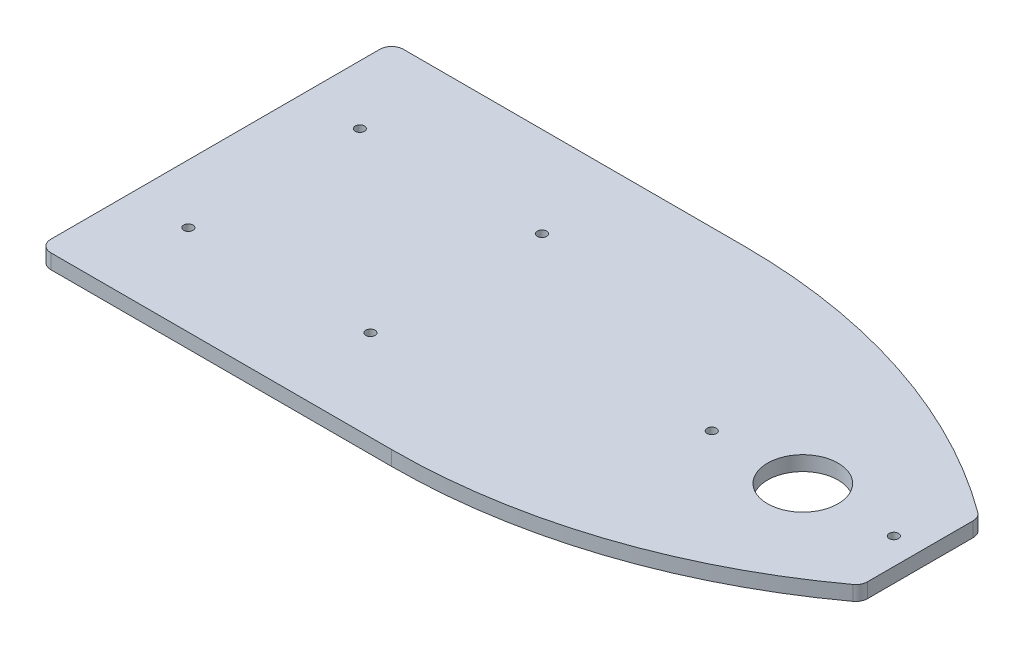
ISO-10303-21;
HEADER;
FILE_DESCRIPTION(('STEP AP214'),'2;1');
FILE_NAME('part.step','',(''),(''),'','','');
FILE_SCHEMA(('AUTOMOTIVE_DESIGN { 1 0 10303 214 1 1 1 1 }'));
ENDSEC;
DATA;
#1=APPLICATION_CONTEXT('core data for automotive mechanical design processes');
#2=APPLICATION_PROTOCOL_DEFINITION('international standard','automotive_design',2000,#1);
#3=PRODUCT_CONTEXT('',#1,'mechanical');
#4=PRODUCT('Part','Part','',(#3));
#5=PRODUCT_RELATED_PRODUCT_CATEGORY('part','',(#4));
#6=PRODUCT_DEFINITION_FORMATION('','',#4);
#7=PRODUCT_DEFINITION_CONTEXT('part definition',#1,'design');
#8=PRODUCT_DEFINITION('design','',#6,#7);
#9=PRODUCT_DEFINITION_SHAPE('','',#8);
#10=(LENGTH_UNIT() NAMED_UNIT(*) SI_UNIT(.MILLI.,.METRE.));
#11=(NAMED_UNIT(*) PLANE_ANGLE_UNIT() SI_UNIT($,.RADIAN.));
#12=(NAMED_UNIT(*) SI_UNIT($,.STERADIAN.) SOLID_ANGLE_UNIT());
#13=UNCERTAINTY_MEASURE_WITH_UNIT(LENGTH_MEASURE(1.E-05),#10,'distance_accuracy_value','');
#14=(GEOMETRIC_REPRESENTATION_CONTEXT(3) GLOBAL_UNCERTAINTY_ASSIGNED_CONTEXT((#13)) GLOBAL_UNIT_ASSIGNED_CONTEXT((#10,
#11,#12)) REPRESENTATION_CONTEXT('',''));
#15=CARTESIAN_POINT('',(0.,0.,0.));
#16=DIRECTION('',(0.,0.,1.));
#17=DIRECTION('',(1.,0.,0.));
#18=AXIS2_PLACEMENT_3D('',#15,#16,#17);
#19=CARTESIAN_POINT('',(76.2,3.175,38.1));
#20=DIRECTION('',(-1.,0.,0.));
#21=DIRECTION('',(0.,0.,1.));
#22=AXIS2_PLACEMENT_3D('',#19,#20,#21);
#23=PLANE('',#22);
#24=DIRECTION('',(0.,0.,-1.));
#25=VECTOR('',#24,1.);
#26=CARTESIAN_POINT('',(76.2,3.175,38.1));
#27=LINE('',#26,#25);
#28=CARTESIAN_POINT('',(76.2,3.175,11.421961703308));
#29=VERTEX_POINT('',#28);
#30=CARTESIAN_POINT('',(76.2,3.175,-11.421961703308));
#31=VERTEX_POINT('',#30);
#32=EDGE_CURVE('E188',#29,#31,#27,.T.);
#33=ORIENTED_EDGE('',*,*,#32,.F.);
#34=DIRECTION('',(0.,1.,0.));
#35=VECTOR('',#34,1.);
#36=CARTESIAN_POINT('',(76.2,3.175,11.421961703308));
#37=LINE('',#36,#35);
#38=CARTESIAN_POINT('',(76.2,0.,11.421961703308));
#39=VERTEX_POINT('',#38);
#40=EDGE_CURVE('E156',#29,#39,#37,.F.);
#41=ORIENTED_EDGE('',*,*,#40,.T.);
#42=DIRECTION('',(0.,0.,-1.));
#43=VECTOR('',#42,1.);
#44=CARTESIAN_POINT('',(76.2,0.,38.1));
#45=LINE('',#44,#43);
#46=CARTESIAN_POINT('',(76.2,0.,-11.421961703308));
#47=VERTEX_POINT('',#46);
#48=EDGE_CURVE('E138',#39,#47,#45,.T.);
#49=ORIENTED_EDGE('',*,*,#48,.T.);
#50=DIRECTION('',(0.,1.,0.));
#51=VECTOR('',#50,1.);
#52=CARTESIAN_POINT('',(76.2,3.175,-11.421961703308));
#53=LINE('',#52,#51);
#54=EDGE_CURVE('E157',#47,#31,#53,.T.);
#55=ORIENTED_EDGE('',*,*,#54,.T.);
#56=EDGE_LOOP('',(#33,#41,#49,#55));
#57=FACE_BOUND('',#56,.T.);
#58=ADVANCED_FACE('F39',(#57),#23,.F.);
#59=CARTESIAN_POINT('',(76.2,3.175,-38.1));
#60=DIRECTION('',(0.,0.,1.));
#61=DIRECTION('',(1.,0.,0.));
#62=AXIS2_PLACEMENT_3D('',#59,#60,#61);
#63=PLANE('',#62);
#64=DIRECTION('',(-1.,0.,0.));
#65=VECTOR('',#64,1.);
#66=CARTESIAN_POINT('',(76.2,0.,-38.1));
#67=LINE('',#66,#65);
#68=CARTESIAN_POINT('',(0.,0.,-38.1));
#69=VERTEX_POINT('',#68);
#70=CARTESIAN_POINT('',(-73.6599999999999,0.,-38.1));
#71=VERTEX_POINT('',#70);
#72=EDGE_CURVE('E132',#69,#71,#67,.T.);
#73=ORIENTED_EDGE('',*,*,#72,.T.);
#74=DIRECTION('',(0.,-1.,0.));
#75=VECTOR('',#74,1.);
#76=CARTESIAN_POINT('',(-73.66,3.175,-38.1));
#77=LINE('',#76,#75);
#78=CARTESIAN_POINT('',(-73.6599999999999,3.175,-38.1));
#79=VERTEX_POINT('',#78);
#80=EDGE_CURVE('E11',#71,#79,#77,.F.);
#81=ORIENTED_EDGE('',*,*,#80,.T.);
#82=DIRECTION('',(-1.,0.,0.));
#83=VECTOR('',#82,1.);
#84=CARTESIAN_POINT('',(76.2,3.175,-38.1));
#85=LINE('',#84,#83);
#86=CARTESIAN_POINT('',(0.,3.175,-38.1));
#87=VERTEX_POINT('',#86);
#88=EDGE_CURVE('E134',#87,#79,#85,.T.);
#89=ORIENTED_EDGE('',*,*,#88,.F.);
#90=DIRECTION('',(0.,1.,0.));
#91=VECTOR('',#90,1.);
#92=CARTESIAN_POINT('',(0.,0.,-38.1));
#93=LINE('',#92,#91);
#94=EDGE_CURVE('E122',#69,#87,#93,.T.);
#95=ORIENTED_EDGE('',*,*,#94,.F.);
#96=EDGE_LOOP('',(#73,#81,#89,#95));
#97=FACE_BOUND('',#96,.T.);
#98=ADVANCED_FACE('F128',(#97),#63,.F.);
#99=CARTESIAN_POINT('',(0.,3.175,0.));
#100=DIRECTION('',(0.,1.,0.));
#101=DIRECTION('',(0.,0.,1.));
#102=AXIS2_PLACEMENT_3D('',#99,#100,#101);
#103=PLANE('',#102);
#104=CARTESIAN_POINT('',(-63.5,3.175,18.542));
#105=DIRECTION('',(0.,1.,0.));
#106=DIRECTION('',(0.,0.,1.));
#107=AXIS2_PLACEMENT_3D('',#104,#105,#106);
#108=CIRCLE('',#107,1.0033);
#109=CARTESIAN_POINT('',(-63.5,3.175,19.5453));
#110=VERTEX_POINT('',#109);
#111=EDGE_CURVE('E235',#110,#110,#108,.T.);
#112=ORIENTED_EDGE('',*,*,#111,.F.);
#113=EDGE_LOOP('',(#112));
#114=FACE_BOUND('',#113,.T.);
#115=CARTESIAN_POINT('',(-24.13,3.175,18.542));
#116=DIRECTION('',(0.,1.,0.));
#117=DIRECTION('',(0.,0.,1.));
#118=AXIS2_PLACEMENT_3D('',#115,#116,#117);
#119=CIRCLE('',#118,1.0033);
#120=CARTESIAN_POINT('',(-24.13,3.175,19.5453));
#121=VERTEX_POINT('',#120);
#122=EDGE_CURVE('E238',#121,#121,#119,.T.);
#123=ORIENTED_EDGE('',*,*,#122,.F.);
#124=EDGE_LOOP('',(#123));
#125=FACE_BOUND('',#124,.T.);
#126=CARTESIAN_POINT('',(-24.13,3.175,-18.542));
#127=DIRECTION('',(0.,1.,0.));
#128=DIRECTION('',(0.,0.,1.));
#129=AXIS2_PLACEMENT_3D('',#126,#127,#128);
#130=CIRCLE('',#129,1.0033);
#131=CARTESIAN_POINT('',(-24.13,3.175,-17.5387));
#132=VERTEX_POINT('',#131);
#133=EDGE_CURVE('E242',#132,#132,#130,.T.);
#134=ORIENTED_EDGE('',*,*,#133,.F.);
#135=EDGE_LOOP('',(#134));
#136=FACE_BOUND('',#135,.T.);
#137=CARTESIAN_POINT('',(-63.5,3.175,-18.542));
#138=DIRECTION('',(0.,1.,0.));
#139=DIRECTION('',(0.,0.,1.));
#140=AXIS2_PLACEMENT_3D('',#137,#138,#139);
#141=CIRCLE('',#140,1.0033);
#142=CARTESIAN_POINT('',(-63.5,3.175,-17.5387));
#143=VERTEX_POINT('',#142);
#144=EDGE_CURVE('E228',#143,#143,#141,.T.);
#145=ORIENTED_EDGE('',*,*,#144,.F.);
#146=EDGE_LOOP('',(#145));
#147=FACE_BOUND('',#146,.T.);
#148=CARTESIAN_POINT('',(31.115,3.175,0.));
#149=DIRECTION('',(0.,1.,0.));
#150=DIRECTION('',(0.,0.,1.));
#151=AXIS2_PLACEMENT_3D('',#148,#149,#150);
#152=CIRCLE('',#151,1.0033);
#153=CARTESIAN_POINT('',(31.115,3.175,1.0033));
#154=VERTEX_POINT('',#153);
#155=EDGE_CURVE('E222',#154,#154,#152,.T.);
#156=ORIENTED_EDGE('',*,*,#155,.F.);
#157=EDGE_LOOP('',(#156));
#158=FACE_BOUND('',#157,.T.);
#159=CARTESIAN_POINT('',(70.485,3.175,0.));
#160=DIRECTION('',(0.,1.,0.));
#161=DIRECTION('',(0.,0.,1.));
#162=AXIS2_PLACEMENT_3D('',#159,#160,#161);
#163=CIRCLE('',#162,1.0033);
#164=CARTESIAN_POINT('',(70.485,3.175,1.0033));
#165=VERTEX_POINT('',#164);
#166=EDGE_CURVE('E219',#165,#165,#163,.T.);
#167=ORIENTED_EDGE('',*,*,#166,.F.);
#168=EDGE_LOOP('',(#167));
#169=FACE_BOUND('',#168,.T.);
#170=CARTESIAN_POINT('',(50.8,3.175,0.));
#171=DIRECTION('',(0.,1.,0.));
#172=DIRECTION('',(0.,0.,1.));
#173=AXIS2_PLACEMENT_3D('',#170,#171,#172);
#174=CIRCLE('',#173,7.62);
#175=CARTESIAN_POINT('',(50.8,3.175,7.62));
#176=VERTEX_POINT('',#175);
#177=EDGE_CURVE('E206',#176,#176,#174,.T.);
#178=ORIENTED_EDGE('',*,*,#177,.F.);
#179=EDGE_LOOP('',(#178));
#180=FACE_BOUND('',#179,.T.);
#181=DIRECTION('',(0.,0.,1.));
#182=VECTOR('',#181,1.);
#183=CARTESIAN_POINT('',(-76.2,3.175,38.1));
#184=LINE('',#183,#182);
#185=CARTESIAN_POINT('',(-76.2,3.175,-35.56));
#186=VERTEX_POINT('',#185);
#187=CARTESIAN_POINT('',(-76.2,3.175,35.56));
#188=VERTEX_POINT('',#187);
#189=EDGE_CURVE('E136',#186,#188,#184,.T.);
#190=ORIENTED_EDGE('',*,*,#189,.T.);
#191=CARTESIAN_POINT('',(-73.66,3.175,35.56));
#192=DIRECTION('',(0.,1.,0.));
#193=DIRECTION('',(0.,0.,1.));
#194=AXIS2_PLACEMENT_3D('',#191,#192,#193);
#195=CIRCLE('',#194,2.54);
#196=CARTESIAN_POINT('',(-73.6599999999999,3.175,38.1));
#197=VERTEX_POINT('',#196);
#198=EDGE_CURVE('E50',#188,#197,#195,.T.);
#199=ORIENTED_EDGE('',*,*,#198,.T.);
#200=DIRECTION('',(1.,0.,0.));
#201=VECTOR('',#200,1.);
#202=CARTESIAN_POINT('',(76.2,3.175,38.1));
#203=LINE('',#202,#201);
#204=CARTESIAN_POINT('',(0.,3.175,38.1));
#205=VERTEX_POINT('',#204);
#206=EDGE_CURVE('E145',#197,#205,#203,.T.);
#207=ORIENTED_EDGE('',*,*,#206,.T.);
#208=CARTESIAN_POINT('',(0.,3.175,-88.9));
#209=DIRECTION('',(0.,-1.,0.));
#210=DIRECTION('',(0.,0.,1.));
#211=AXIS2_PLACEMENT_3D('',#208,#209,#210);
#212=CIRCLE('',#211,127.);
#213=CARTESIAN_POINT('',(75.1632653061225,3.175,13.4693486768449));
#214=VERTEX_POINT('',#213);
#215=EDGE_CURVE('E205',#214,#205,#212,.T.);
#216=ORIENTED_EDGE('',*,*,#215,.F.);
#217=CARTESIAN_POINT('',(73.66,3.175,11.421961703308));
#218=DIRECTION('',(0.,1.,0.));
#219=DIRECTION('',(0.,0.,1.));
#220=AXIS2_PLACEMENT_3D('',#217,#218,#219);
#221=CIRCLE('',#220,2.54);
#222=EDGE_CURVE('E151',#214,#29,#221,.T.);
#223=ORIENTED_EDGE('',*,*,#222,.T.);
#224=ORIENTED_EDGE('',*,*,#32,.T.);
#225=CARTESIAN_POINT('',(73.66,3.175,-11.421961703308));
#226=DIRECTION('',(0.,1.,0.));
#227=DIRECTION('',(0.,0.,1.));
#228=AXIS2_PLACEMENT_3D('',#225,#226,#227);
#229=CIRCLE('',#228,2.54);
#230=CARTESIAN_POINT('',(75.1632653061225,3.175,-13.469348676845));
#231=VERTEX_POINT('',#230);
#232=EDGE_CURVE('E154',#31,#231,#229,.T.);
#233=ORIENTED_EDGE('',*,*,#232,.T.);
#234=CARTESIAN_POINT('',(0.,3.175,88.9));
#235=DIRECTION('',(0.,-1.,0.));
#236=DIRECTION('',(0.,0.,-1.));
#237=AXIS2_PLACEMENT_3D('',#234,#235,#236);
#238=CIRCLE('',#237,127.);
#239=EDGE_CURVE('E129',#87,#231,#238,.T.);
#240=ORIENTED_EDGE('',*,*,#239,.F.);
#241=ORIENTED_EDGE('',*,*,#88,.T.);
#242=CARTESIAN_POINT('',(-73.66,3.175,-35.56));
#243=DIRECTION('',(0.,1.,0.));
#244=DIRECTION('',(0.,0.,1.));
#245=AXIS2_PLACEMENT_3D('',#242,#243,#244);
#246=CIRCLE('',#245,2.54);
#247=EDGE_CURVE('E176',#79,#186,#246,.T.);
#248=ORIENTED_EDGE('',*,*,#247,.T.);
#249=EDGE_LOOP('',(#190,#199,#207,#216,#223,#224,#233,#240,#241,#248));
#250=FACE_BOUND('',#249,.T.);
#251=ADVANCED_FACE('F179',(#114,#125,#136,#147,#158,#169,#180,#250),#103,.T.);
#252=CARTESIAN_POINT('',(0.,0.,0.));
#253=DIRECTION('',(0.,1.,0.));
#254=DIRECTION('',(0.,0.,1.));
#255=AXIS2_PLACEMENT_3D('',#252,#253,#254);
#256=PLANE('',#255);
#257=CARTESIAN_POINT('',(-63.5,0.,18.542));
#258=DIRECTION('',(0.,1.,0.));
#259=DIRECTION('',(0.,0.,1.));
#260=AXIS2_PLACEMENT_3D('',#257,#258,#259);
#261=CIRCLE('',#260,1.0033);
#262=CARTESIAN_POINT('',(-63.5,0.,19.5453));
#263=VERTEX_POINT('',#262);
#264=EDGE_CURVE('E232',#263,#263,#261,.T.);
#265=ORIENTED_EDGE('',*,*,#264,.T.);
#266=EDGE_LOOP('',(#265));
#267=FACE_BOUND('',#266,.T.);
#268=CARTESIAN_POINT('',(-24.13,0.,18.542));
#269=DIRECTION('',(0.,1.,0.));
#270=DIRECTION('',(0.,0.,1.));
#271=AXIS2_PLACEMENT_3D('',#268,#269,#270);
#272=CIRCLE('',#271,1.0033);
#273=CARTESIAN_POINT('',(-24.13,0.,19.5453));
#274=VERTEX_POINT('',#273);
#275=EDGE_CURVE('E241',#274,#274,#272,.T.);
#276=ORIENTED_EDGE('',*,*,#275,.T.);
#277=EDGE_LOOP('',(#276));
#278=FACE_BOUND('',#277,.T.);
#279=CARTESIAN_POINT('',(-24.13,0.,-18.542));
#280=DIRECTION('',(0.,1.,0.));
#281=DIRECTION('',(0.,0.,1.));
#282=AXIS2_PLACEMENT_3D('',#279,#280,#281);
#283=CIRCLE('',#282,1.0033);
#284=CARTESIAN_POINT('',(-24.13,0.,-17.5387));
#285=VERTEX_POINT('',#284);
#286=EDGE_CURVE('E230',#285,#285,#283,.T.);
#287=ORIENTED_EDGE('',*,*,#286,.T.);
#288=EDGE_LOOP('',(#287));
#289=FACE_BOUND('',#288,.T.);
#290=CARTESIAN_POINT('',(-63.5,0.,-18.542));
#291=DIRECTION('',(0.,1.,0.));
#292=DIRECTION('',(0.,0.,1.));
#293=AXIS2_PLACEMENT_3D('',#290,#291,#292);
#294=CIRCLE('',#293,1.0033);
#295=CARTESIAN_POINT('',(-63.5,0.,-17.5387));
#296=VERTEX_POINT('',#295);
#297=EDGE_CURVE('E220',#296,#296,#294,.T.);
#298=ORIENTED_EDGE('',*,*,#297,.T.);
#299=EDGE_LOOP('',(#298));
#300=FACE_BOUND('',#299,.T.);
#301=CARTESIAN_POINT('',(31.115,0.,0.));
#302=DIRECTION('',(0.,1.,0.));
#303=DIRECTION('',(0.,0.,1.));
#304=AXIS2_PLACEMENT_3D('',#301,#302,#303);
#305=CIRCLE('',#304,1.0033);
#306=CARTESIAN_POINT('',(31.115,0.,1.0033));
#307=VERTEX_POINT('',#306);
#308=EDGE_CURVE('E212',#307,#307,#305,.T.);
#309=ORIENTED_EDGE('',*,*,#308,.T.);
#310=EDGE_LOOP('',(#309));
#311=FACE_BOUND('',#310,.T.);
#312=CARTESIAN_POINT('',(70.485,0.,0.));
#313=DIRECTION('',(0.,1.,0.));
#314=DIRECTION('',(0.,0.,1.));
#315=AXIS2_PLACEMENT_3D('',#312,#313,#314);
#316=CIRCLE('',#315,1.0033);
#317=CARTESIAN_POINT('',(70.485,0.,1.0033));
#318=VERTEX_POINT('',#317);
#319=EDGE_CURVE('E211',#318,#318,#316,.T.);
#320=ORIENTED_EDGE('',*,*,#319,.T.);
#321=EDGE_LOOP('',(#320));
#322=FACE_BOUND('',#321,.T.);
#323=CARTESIAN_POINT('',(50.8,0.,0.));
#324=DIRECTION('',(0.,1.,0.));
#325=DIRECTION('',(0.,0.,1.));
#326=AXIS2_PLACEMENT_3D('',#323,#324,#325);
#327=CIRCLE('',#326,7.62);
#328=CARTESIAN_POINT('',(50.8,0.,7.62));
#329=VERTEX_POINT('',#328);
#330=EDGE_CURVE('E203',#329,#329,#327,.T.);
#331=ORIENTED_EDGE('',*,*,#330,.T.);
#332=EDGE_LOOP('',(#331));
#333=FACE_BOUND('',#332,.T.);
#334=DIRECTION('',(1.,0.,0.));
#335=VECTOR('',#334,1.);
#336=CARTESIAN_POINT('',(76.2,0.,38.1));
#337=LINE('',#336,#335);
#338=CARTESIAN_POINT('',(-73.6599999999999,0.,38.1));
#339=VERTEX_POINT('',#338);
#340=CARTESIAN_POINT('',(0.,0.,38.0999999999999));
#341=VERTEX_POINT('',#340);
#342=EDGE_CURVE('E143',#339,#341,#337,.T.);
#343=ORIENTED_EDGE('',*,*,#342,.F.);
#344=CARTESIAN_POINT('',(-73.66,0.,35.56));
#345=DIRECTION('',(0.,1.,0.));
#346=DIRECTION('',(0.,0.,1.));
#347=AXIS2_PLACEMENT_3D('',#344,#345,#346);
#348=CIRCLE('',#347,2.54);
#349=CARTESIAN_POINT('',(-76.2,0.,35.56));
#350=VERTEX_POINT('',#349);
#351=EDGE_CURVE('E167',#339,#350,#348,.F.);
#352=ORIENTED_EDGE('',*,*,#351,.T.);
#353=DIRECTION('',(0.,0.,1.));
#354=VECTOR('',#353,1.);
#355=CARTESIAN_POINT('',(-76.2,0.,38.1));
#356=LINE('',#355,#354);
#357=CARTESIAN_POINT('',(-76.2,0.,-35.56));
#358=VERTEX_POINT('',#357);
#359=EDGE_CURVE('E135',#358,#350,#356,.T.);
#360=ORIENTED_EDGE('',*,*,#359,.F.);
#361=CARTESIAN_POINT('',(-73.66,0.,-35.56));
#362=DIRECTION('',(0.,1.,0.));
#363=DIRECTION('',(0.,0.,1.));
#364=AXIS2_PLACEMENT_3D('',#361,#362,#363);
#365=CIRCLE('',#364,2.54);
#366=EDGE_CURVE('E140',#358,#71,#365,.F.);
#367=ORIENTED_EDGE('',*,*,#366,.T.);
#368=ORIENTED_EDGE('',*,*,#72,.F.);
#369=CARTESIAN_POINT('',(0.,0.,88.9));
#370=DIRECTION('',(0.,-1.,0.));
#371=DIRECTION('',(0.,0.,-1.));
#372=AXIS2_PLACEMENT_3D('',#369,#370,#371);
#373=CIRCLE('',#372,127.);
#374=CARTESIAN_POINT('',(75.1632653061225,0.,-13.469348676845));
#375=VERTEX_POINT('',#374);
#376=EDGE_CURVE('E120',#69,#375,#373,.T.);
#377=ORIENTED_EDGE('',*,*,#376,.T.);
#378=CARTESIAN_POINT('',(73.66,0.,-11.421961703308));
#379=DIRECTION('',(0.,1.,0.));
#380=DIRECTION('',(0.,0.,1.));
#381=AXIS2_PLACEMENT_3D('',#378,#379,#380);
#382=CIRCLE('',#381,2.54);
#383=EDGE_CURVE('E163',#375,#47,#382,.F.);
#384=ORIENTED_EDGE('',*,*,#383,.T.);
#385=ORIENTED_EDGE('',*,*,#48,.F.);
#386=CARTESIAN_POINT('',(73.66,0.,11.421961703308));
#387=DIRECTION('',(0.,1.,0.));
#388=DIRECTION('',(0.,0.,1.));
#389=AXIS2_PLACEMENT_3D('',#386,#387,#388);
#390=CIRCLE('',#389,2.54);
#391=CARTESIAN_POINT('',(75.1632653061225,0.,13.4693486768449));
#392=VERTEX_POINT('',#391);
#393=EDGE_CURVE('E161',#39,#392,#390,.F.);
#394=ORIENTED_EDGE('',*,*,#393,.T.);
#395=CARTESIAN_POINT('',(0.,0.,-88.9));
#396=DIRECTION('',(0.,-1.,0.));
#397=DIRECTION('',(0.,0.,1.));
#398=AXIS2_PLACEMENT_3D('',#395,#396,#397);
#399=CIRCLE('',#398,127.);
#400=EDGE_CURVE('E202',#392,#341,#399,.T.);
#401=ORIENTED_EDGE('',*,*,#400,.T.);
#402=EDGE_LOOP('',(#343,#352,#360,#367,#368,#377,#384,#385,#394,#401));
#403=FACE_BOUND('',#402,.T.);
#404=ADVANCED_FACE('F137',(#267,#278,#289,#300,#311,#322,#333,#403),#256,.F.);
#405=CARTESIAN_POINT('',(-76.2,3.175,38.1));
#406=DIRECTION('',(1.,0.,0.));
#407=DIRECTION('',(0.,0.,-1.));
#408=AXIS2_PLACEMENT_3D('',#405,#406,#407);
#409=PLANE('',#408);
#410=ORIENTED_EDGE('',*,*,#359,.T.);
#411=DIRECTION('',(0.,-1.,0.));
#412=VECTOR('',#411,1.);
#413=CARTESIAN_POINT('',(-76.2,3.175,35.56));
#414=LINE('',#413,#412);
#415=EDGE_CURVE('E58',#350,#188,#414,.F.);
#416=ORIENTED_EDGE('',*,*,#415,.T.);
#417=ORIENTED_EDGE('',*,*,#189,.F.);
#418=DIRECTION('',(0.,-1.,0.));
#419=VECTOR('',#418,1.);
#420=CARTESIAN_POINT('',(-76.2,3.175,-35.56));
#421=LINE('',#420,#419);
#422=EDGE_CURVE('E175',#186,#358,#421,.T.);
#423=ORIENTED_EDGE('',*,*,#422,.T.);
#424=EDGE_LOOP('',(#410,#416,#417,#423));
#425=FACE_BOUND('',#424,.T.);
#426=ADVANCED_FACE('F191',(#425),#409,.F.);
#427=CARTESIAN_POINT('',(76.2,3.175,38.1));
#428=DIRECTION('',(0.,0.,-1.));
#429=DIRECTION('',(-1.,0.,0.));
#430=AXIS2_PLACEMENT_3D('',#427,#428,#429);
#431=PLANE('',#430);
#432=ORIENTED_EDGE('',*,*,#206,.F.);
#433=DIRECTION('',(0.,-1.,0.));
#434=VECTOR('',#433,1.);
#435=CARTESIAN_POINT('',(-73.66,3.175,38.1));
#436=LINE('',#435,#434);
#437=EDGE_CURVE('E168',#197,#339,#436,.T.);
#438=ORIENTED_EDGE('',*,*,#437,.T.);
#439=ORIENTED_EDGE('',*,*,#342,.T.);
#440=DIRECTION('',(0.,1.,0.));
#441=VECTOR('',#440,1.);
#442=CARTESIAN_POINT('',(0.,0.,38.1));
#443=LINE('',#442,#441);
#444=EDGE_CURVE('E186',#341,#205,#443,.T.);
#445=ORIENTED_EDGE('',*,*,#444,.T.);
#446=EDGE_LOOP('',(#432,#438,#439,#445));
#447=FACE_BOUND('',#446,.T.);
#448=ADVANCED_FACE('F190',(#447),#431,.F.);
#449=CARTESIAN_POINT('',(0.,0.,-88.9));
#450=DIRECTION('',(0.,1.,0.));
#451=DIRECTION('',(0.,0.,1.));
#452=AXIS2_PLACEMENT_3D('',#449,#450,#451);
#453=CYLINDRICAL_SURFACE('',#452,127.);
#454=ORIENTED_EDGE('',*,*,#400,.F.);
#455=DIRECTION('',(0.,1.,0.));
#456=VECTOR('',#455,1.);
#457=CARTESIAN_POINT('',(75.1632653061225,0.,13.4693486768449));
#458=LINE('',#457,#456);
#459=EDGE_CURVE('E146',#392,#214,#458,.T.);
#460=ORIENTED_EDGE('',*,*,#459,.T.);
#461=ORIENTED_EDGE('',*,*,#215,.T.);
#462=ORIENTED_EDGE('',*,*,#444,.F.);
#463=EDGE_LOOP('',(#454,#460,#461,#462));
#464=FACE_BOUND('',#463,.T.);
#465=ADVANCED_FACE('F297',(#464),#453,.T.);
#466=CARTESIAN_POINT('',(0.,0.,88.9));
#467=DIRECTION('',(0.,1.,0.));
#468=DIRECTION('',(0.,0.,1.));
#469=AXIS2_PLACEMENT_3D('',#466,#467,#468);
#470=CYLINDRICAL_SURFACE('',#469,127.);
#471=ORIENTED_EDGE('',*,*,#239,.T.);
#472=DIRECTION('',(0.,1.,0.));
#473=VECTOR('',#472,1.);
#474=CARTESIAN_POINT('',(75.1632653061225,0.,-13.469348676845));
#475=LINE('',#474,#473);
#476=EDGE_CURVE('E121',#231,#375,#475,.F.);
#477=ORIENTED_EDGE('',*,*,#476,.T.);
#478=ORIENTED_EDGE('',*,*,#376,.F.);
#479=ORIENTED_EDGE('',*,*,#94,.T.);
#480=EDGE_LOOP('',(#471,#477,#478,#479));
#481=FACE_BOUND('',#480,.T.);
#482=ADVANCED_FACE('F119',(#481),#470,.T.);
#483=CARTESIAN_POINT('',(73.66,0.,11.421961703308));
#484=DIRECTION('',(0.,1.,0.));
#485=DIRECTION('',(0.,0.,1.));
#486=AXIS2_PLACEMENT_3D('',#483,#484,#485);
#487=CYLINDRICAL_SURFACE('',#486,2.54);
#488=ORIENTED_EDGE('',*,*,#393,.F.);
#489=ORIENTED_EDGE('',*,*,#40,.F.);
#490=ORIENTED_EDGE('',*,*,#222,.F.);
#491=ORIENTED_EDGE('',*,*,#459,.F.);
#492=EDGE_LOOP('',(#488,#489,#490,#491));
#493=FACE_BOUND('',#492,.T.);
#494=ADVANCED_FACE('F303',(#493),#487,.T.);
#495=CARTESIAN_POINT('',(73.66,0.,-11.421961703308));
#496=DIRECTION('',(0.,1.,0.));
#497=DIRECTION('',(0.,0.,1.));
#498=AXIS2_PLACEMENT_3D('',#495,#496,#497);
#499=CYLINDRICAL_SURFACE('',#498,2.54);
#500=ORIENTED_EDGE('',*,*,#383,.F.);
#501=ORIENTED_EDGE('',*,*,#476,.F.);
#502=ORIENTED_EDGE('',*,*,#232,.F.);
#503=ORIENTED_EDGE('',*,*,#54,.F.);
#504=EDGE_LOOP('',(#500,#501,#502,#503));
#505=FACE_BOUND('',#504,.T.);
#506=ADVANCED_FACE('F306',(#505),#499,.T.);
#507=CARTESIAN_POINT('',(-73.66,3.175,35.56));
#508=DIRECTION('',(0.,-1.,0.));
#509=DIRECTION('',(0.,0.,-1.));
#510=AXIS2_PLACEMENT_3D('',#507,#508,#509);
#511=CYLINDRICAL_SURFACE('',#510,2.54);
#512=ORIENTED_EDGE('',*,*,#198,.F.);
#513=ORIENTED_EDGE('',*,*,#415,.F.);
#514=ORIENTED_EDGE('',*,*,#351,.F.);
#515=ORIENTED_EDGE('',*,*,#437,.F.);
#516=EDGE_LOOP('',(#512,#513,#514,#515));
#517=FACE_BOUND('',#516,.T.);
#518=ADVANCED_FACE('F195',(#517),#511,.T.);
#519=CARTESIAN_POINT('',(-73.66,3.175,-35.56));
#520=DIRECTION('',(0.,-1.,0.));
#521=DIRECTION('',(0.,0.,-1.));
#522=AXIS2_PLACEMENT_3D('',#519,#520,#521);
#523=CYLINDRICAL_SURFACE('',#522,2.54);
#524=ORIENTED_EDGE('',*,*,#247,.F.);
#525=ORIENTED_EDGE('',*,*,#80,.F.);
#526=ORIENTED_EDGE('',*,*,#366,.F.);
#527=ORIENTED_EDGE('',*,*,#422,.F.);
#528=EDGE_LOOP('',(#524,#525,#526,#527));
#529=FACE_BOUND('',#528,.T.);
#530=ADVANCED_FACE('F41',(#529),#523,.T.);
#531=CARTESIAN_POINT('',(50.8,0.,0.));
#532=DIRECTION('',(0.,1.,0.));
#533=DIRECTION('',(0.,0.,1.));
#534=AXIS2_PLACEMENT_3D('',#531,#532,#533);
#535=CYLINDRICAL_SURFACE('',#534,7.62);
#536=ORIENTED_EDGE('',*,*,#330,.F.);
#537=EDGE_LOOP('',(#536));
#538=FACE_BOUND('',#537,.T.);
#539=ORIENTED_EDGE('',*,*,#177,.T.);
#540=EDGE_LOOP('',(#539));
#541=FACE_BOUND('',#540,.T.);
#542=ADVANCED_FACE('F275',(#538,#541),#535,.F.);
#543=CARTESIAN_POINT('',(70.485,0.,0.));
#544=DIRECTION('',(0.,1.,0.));
#545=DIRECTION('',(0.,0.,1.));
#546=AXIS2_PLACEMENT_3D('',#543,#544,#545);
#547=CYLINDRICAL_SURFACE('',#546,1.0033);
#548=ORIENTED_EDGE('',*,*,#319,.F.);
#549=EDGE_LOOP('',(#548));
#550=FACE_BOUND('',#549,.T.);
#551=ORIENTED_EDGE('',*,*,#166,.T.);
#552=EDGE_LOOP('',(#551));
#553=FACE_BOUND('',#552,.T.);
#554=ADVANCED_FACE('F274',(#550,#553),#547,.F.);
#555=CARTESIAN_POINT('',(31.115,0.,0.));
#556=DIRECTION('',(0.,1.,0.));
#557=DIRECTION('',(0.,0.,1.));
#558=AXIS2_PLACEMENT_3D('',#555,#556,#557);
#559=CYLINDRICAL_SURFACE('',#558,1.0033);
#560=ORIENTED_EDGE('',*,*,#308,.F.);
#561=EDGE_LOOP('',(#560));
#562=FACE_BOUND('',#561,.T.);
#563=ORIENTED_EDGE('',*,*,#155,.T.);
#564=EDGE_LOOP('',(#563));
#565=FACE_BOUND('',#564,.T.);
#566=ADVANCED_FACE('F282',(#562,#565),#559,.F.);
#567=CARTESIAN_POINT('',(-63.5,0.,-18.542));
#568=DIRECTION('',(0.,1.,0.));
#569=DIRECTION('',(0.,0.,1.));
#570=AXIS2_PLACEMENT_3D('',#567,#568,#569);
#571=CYLINDRICAL_SURFACE('',#570,1.0033);
#572=ORIENTED_EDGE('',*,*,#297,.F.);
#573=EDGE_LOOP('',(#572));
#574=FACE_BOUND('',#573,.T.);
#575=ORIENTED_EDGE('',*,*,#144,.T.);
#576=EDGE_LOOP('',(#575));
#577=FACE_BOUND('',#576,.T.);
#578=ADVANCED_FACE('F257',(#574,#577),#571,.F.);
#579=CARTESIAN_POINT('',(-24.13,0.,-18.542));
#580=DIRECTION('',(0.,1.,0.));
#581=DIRECTION('',(0.,0.,1.));
#582=AXIS2_PLACEMENT_3D('',#579,#580,#581);
#583=CYLINDRICAL_SURFACE('',#582,1.0033);
#584=ORIENTED_EDGE('',*,*,#286,.F.);
#585=EDGE_LOOP('',(#584));
#586=FACE_BOUND('',#585,.T.);
#587=ORIENTED_EDGE('',*,*,#133,.T.);
#588=EDGE_LOOP('',(#587));
#589=FACE_BOUND('',#588,.T.);
#590=ADVANCED_FACE('F255',(#586,#589),#583,.F.);
#591=CARTESIAN_POINT('',(-24.13,0.,18.542));
#592=DIRECTION('',(0.,1.,0.));
#593=DIRECTION('',(0.,0.,1.));
#594=AXIS2_PLACEMENT_3D('',#591,#592,#593);
#595=CYLINDRICAL_SURFACE('',#594,1.0033);
#596=ORIENTED_EDGE('',*,*,#275,.F.);
#597=EDGE_LOOP('',(#596));
#598=FACE_BOUND('',#597,.T.);
#599=ORIENTED_EDGE('',*,*,#122,.T.);
#600=EDGE_LOOP('',(#599));
#601=FACE_BOUND('',#600,.T.);
#602=ADVANCED_FACE('F253',(#598,#601),#595,.F.);
#603=CARTESIAN_POINT('',(-63.5,0.,18.542));
#604=DIRECTION('',(0.,1.,0.));
#605=DIRECTION('',(0.,0.,1.));
#606=AXIS2_PLACEMENT_3D('',#603,#604,#605);
#607=CYLINDRICAL_SURFACE('',#606,1.0033);
#608=ORIENTED_EDGE('',*,*,#264,.F.);
#609=EDGE_LOOP('',(#608));
#610=FACE_BOUND('',#609,.T.);
#611=ORIENTED_EDGE('',*,*,#111,.T.);
#612=EDGE_LOOP('',(#611));
#613=FACE_BOUND('',#612,.T.);
#614=ADVANCED_FACE('F366',(#610,#613),#607,.F.);
#615=CLOSED_SHELL('',(#58,#98,#251,#404,#426,#448,#465,#482,#494,#506,#518,#530,#542,#554,#566,
#578,#590,#602,#614));
#616=MANIFOLD_SOLID_BREP('B2',#615);
#617=ADVANCED_BREP_SHAPE_REPRESENTATION('',(#18,#616),#14);
#618=SHAPE_DEFINITION_REPRESENTATION(#9,#617);
ENDSEC;
END-ISO-10303-21;
